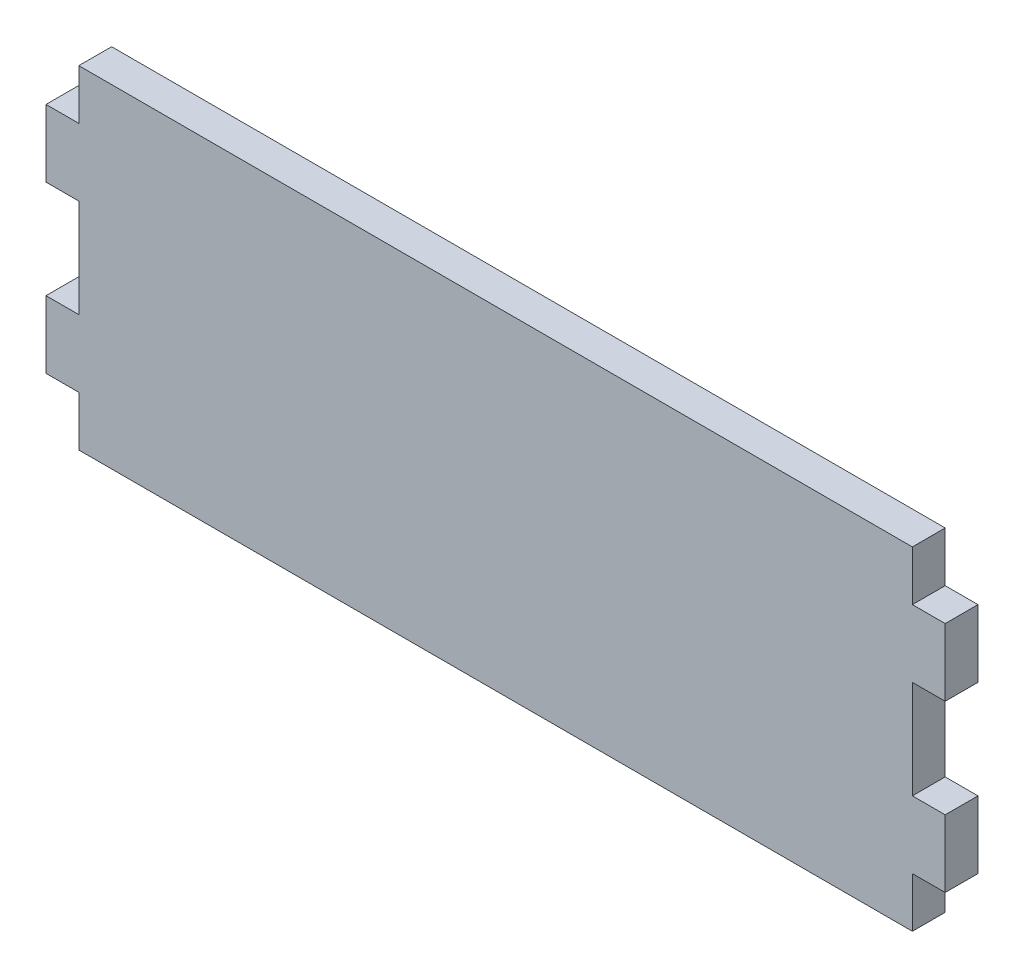
ISO-10303-21;
HEADER;
FILE_DESCRIPTION(('STEP AP214'),'2;1');
FILE_NAME('part.step','',(''),(''),'','','');
FILE_SCHEMA(('AUTOMOTIVE_DESIGN { 1 0 10303 214 1 1 1 1 }'));
ENDSEC;
DATA;
#1=APPLICATION_CONTEXT('core data for automotive mechanical design processes');
#2=APPLICATION_PROTOCOL_DEFINITION('international standard','automotive_design',2000,#1);
#3=PRODUCT_CONTEXT('',#1,'mechanical');
#4=PRODUCT('Part','Part','',(#3));
#5=PRODUCT_RELATED_PRODUCT_CATEGORY('part','',(#4));
#6=PRODUCT_DEFINITION_FORMATION('','',#4);
#7=PRODUCT_DEFINITION_CONTEXT('part definition',#1,'design');
#8=PRODUCT_DEFINITION('design','',#6,#7);
#9=PRODUCT_DEFINITION_SHAPE('','',#8);
#10=(LENGTH_UNIT() NAMED_UNIT(*) SI_UNIT(.MILLI.,.METRE.));
#11=(NAMED_UNIT(*) PLANE_ANGLE_UNIT() SI_UNIT($,.RADIAN.));
#12=(NAMED_UNIT(*) SI_UNIT($,.STERADIAN.) SOLID_ANGLE_UNIT());
#13=UNCERTAINTY_MEASURE_WITH_UNIT(LENGTH_MEASURE(1.E-05),#10,'distance_accuracy_value','');
#14=(GEOMETRIC_REPRESENTATION_CONTEXT(3) GLOBAL_UNCERTAINTY_ASSIGNED_CONTEXT((#13)) GLOBAL_UNIT_ASSIGNED_CONTEXT((#10,
#11,#12)) REPRESENTATION_CONTEXT('',''));
#15=CARTESIAN_POINT('',(0.,0.,0.));
#16=DIRECTION('',(0.,0.,1.));
#17=DIRECTION('',(1.,0.,0.));
#18=AXIS2_PLACEMENT_3D('',#15,#16,#17);
#19=CARTESIAN_POINT('',(-63.5,50.719999906,-5.));
#20=DIRECTION('',(-1.,0.,0.));
#21=DIRECTION('',(0.,0.,1.));
#22=AXIS2_PLACEMENT_3D('',#19,#20,#21);
#23=PLANE('',#22);
#24=DIRECTION('',(0.,0.,-1.));
#25=VECTOR('',#24,1.);
#26=CARTESIAN_POINT('',(-63.5,32.8494999941995,11.4087975961317));
#27=LINE('',#26,#25);
#28=CARTESIAN_POINT('',(-63.5,32.8494999941995,0.));
#29=VERTEX_POINT('',#28);
#30=CARTESIAN_POINT('',(-63.5,32.8494999941995,-5.));
#31=VERTEX_POINT('',#30);
#32=EDGE_CURVE('E51',#29,#31,#27,.T.);
#33=ORIENTED_EDGE('',*,*,#32,.T.);
#34=DIRECTION('',(0.,-1.,0.));
#35=VECTOR('',#34,1.);
#36=CARTESIAN_POINT('',(-63.5,50.719999906,-5.));
#37=LINE('',#36,#35);
#38=CARTESIAN_POINT('',(-63.5,17.8704999118005,-5.));
#39=VERTEX_POINT('',#38);
#40=EDGE_CURVE('E37',#31,#39,#37,.T.);
#41=ORIENTED_EDGE('',*,*,#40,.T.);
#42=DIRECTION('',(0.,0.,-1.));
#43=VECTOR('',#42,1.);
#44=CARTESIAN_POINT('',(-63.5,17.8704999118005,11.4087975961317));
#45=LINE('',#44,#43);
#46=CARTESIAN_POINT('',(-63.5,17.8704999118005,0.));
#47=VERTEX_POINT('',#46);
#48=EDGE_CURVE('E222',#47,#39,#45,.T.);
#49=ORIENTED_EDGE('',*,*,#48,.F.);
#50=DIRECTION('',(0.,-1.,0.));
#51=VECTOR('',#50,1.);
#52=CARTESIAN_POINT('',(-63.5,50.719999906,0.));
#53=LINE('',#52,#51);
#54=EDGE_CURVE('E238',#29,#47,#53,.T.);
#55=ORIENTED_EDGE('',*,*,#54,.F.);
#56=EDGE_LOOP('',(#33,#41,#49,#55));
#57=FACE_BOUND('',#56,.T.);
#58=ADVANCED_FACE('F33',(#57),#23,.T.);
#59=CARTESIAN_POINT('',(-63.5,7.61571261076396,0.));
#60=VERTEX_POINT('',#59);
#61=CARTESIAN_POINT('',(-63.5,0.,0.));
#62=VERTEX_POINT('',#61);
#63=EDGE_CURVE('E241',#60,#62,#53,.T.);
#64=ORIENTED_EDGE('',*,*,#63,.F.);
#65=DIRECTION('',(0.,0.,-1.));
#66=VECTOR('',#65,1.);
#67=CARTESIAN_POINT('',(-63.5,7.61571261076396,11.4087975961317));
#68=LINE('',#67,#66);
#69=CARTESIAN_POINT('',(-63.5,7.61571261076396,-5.));
#70=VERTEX_POINT('',#69);
#71=EDGE_CURVE('E226',#60,#70,#68,.T.);
#72=ORIENTED_EDGE('',*,*,#71,.T.);
#73=CARTESIAN_POINT('',(-63.5,0.,-5.));
#74=VERTEX_POINT('',#73);
#75=EDGE_CURVE('E282',#70,#74,#37,.T.);
#76=ORIENTED_EDGE('',*,*,#75,.T.);
#77=DIRECTION('',(0.,0.,1.));
#78=VECTOR('',#77,1.);
#79=CARTESIAN_POINT('',(-63.5,0.,-5.));
#80=LINE('',#79,#78);
#81=EDGE_CURVE('E287',#74,#62,#80,.T.);
#82=ORIENTED_EDGE('',*,*,#81,.T.);
#83=EDGE_LOOP('',(#64,#72,#76,#82));
#84=FACE_BOUND('',#83,.T.);
#85=ADVANCED_FACE('F398',(#84),#23,.T.);
#86=CARTESIAN_POINT('',(63.5,50.719999906,-5.));
#87=DIRECTION('',(1.,0.,0.));
#88=DIRECTION('',(0.,0.,-1.));
#89=AXIS2_PLACEMENT_3D('',#86,#87,#88);
#90=PLANE('',#89);
#91=DIRECTION('',(0.,0.,-1.));
#92=VECTOR('',#91,1.);
#93=CARTESIAN_POINT('',(63.5,17.8704999118005,11.4087975961317));
#94=LINE('',#93,#92);
#95=CARTESIAN_POINT('',(63.5,17.8704999118005,0.));
#96=VERTEX_POINT('',#95);
#97=CARTESIAN_POINT('',(63.5,17.8704999118005,-5.));
#98=VERTEX_POINT('',#97);
#99=EDGE_CURVE('E363',#96,#98,#94,.T.);
#100=ORIENTED_EDGE('',*,*,#99,.T.);
#101=DIRECTION('',(0.,1.,0.));
#102=VECTOR('',#101,1.);
#103=CARTESIAN_POINT('',(63.5,50.719999906,-5.));
#104=LINE('',#103,#102);
#105=CARTESIAN_POINT('',(63.5,32.8494999941995,-5.));
#106=VERTEX_POINT('',#105);
#107=EDGE_CURVE('E256',#98,#106,#104,.T.);
#108=ORIENTED_EDGE('',*,*,#107,.T.);
#109=DIRECTION('',(0.,0.,-1.));
#110=VECTOR('',#109,1.);
#111=CARTESIAN_POINT('',(63.5,32.8494999941995,11.4087975961317));
#112=LINE('',#111,#110);
#113=CARTESIAN_POINT('',(63.5,32.8494999941995,0.));
#114=VERTEX_POINT('',#113);
#115=EDGE_CURVE('E320',#114,#106,#112,.T.);
#116=ORIENTED_EDGE('',*,*,#115,.F.);
#117=DIRECTION('',(0.,1.,0.));
#118=VECTOR('',#117,1.);
#119=CARTESIAN_POINT('',(63.5,50.719999906,0.));
#120=LINE('',#119,#118);
#121=EDGE_CURVE('E260',#96,#114,#120,.T.);
#122=ORIENTED_EDGE('',*,*,#121,.F.);
#123=EDGE_LOOP('',(#100,#108,#116,#122));
#124=FACE_BOUND('',#123,.T.);
#125=ADVANCED_FACE('F415',(#124),#90,.T.);
#126=CARTESIAN_POINT('',(63.5,43.1042872952361,0.));
#127=VERTEX_POINT('',#126);
#128=CARTESIAN_POINT('',(63.5,50.719999906,0.));
#129=VERTEX_POINT('',#128);
#130=EDGE_CURVE('E272',#127,#129,#120,.T.);
#131=ORIENTED_EDGE('',*,*,#130,.F.);
#132=DIRECTION('',(0.,0.,-1.));
#133=VECTOR('',#132,1.);
#134=CARTESIAN_POINT('',(63.5,43.1042872952361,11.4087975961317));
#135=LINE('',#134,#133);
#136=CARTESIAN_POINT('',(63.5,43.1042872952361,-5.));
#137=VERTEX_POINT('',#136);
#138=EDGE_CURVE('E316',#127,#137,#135,.T.);
#139=ORIENTED_EDGE('',*,*,#138,.T.);
#140=CARTESIAN_POINT('',(63.5,50.719999906,-5.));
#141=VERTEX_POINT('',#140);
#142=EDGE_CURVE('E259',#137,#141,#104,.T.);
#143=ORIENTED_EDGE('',*,*,#142,.T.);
#144=DIRECTION('',(0.,0.,1.));
#145=VECTOR('',#144,1.);
#146=CARTESIAN_POINT('',(63.5,50.719999906,-5.));
#147=LINE('',#146,#145);
#148=EDGE_CURVE('E43',#141,#129,#147,.T.);
#149=ORIENTED_EDGE('',*,*,#148,.T.);
#150=EDGE_LOOP('',(#131,#139,#143,#149));
#151=FACE_BOUND('',#150,.T.);
#152=ADVANCED_FACE('F417',(#151),#90,.T.);
#153=DIRECTION('',(0.,0.,-1.));
#154=VECTOR('',#153,1.);
#155=CARTESIAN_POINT('',(-63.5,43.1042872952361,11.4087975961317));
#156=LINE('',#155,#154);
#157=CARTESIAN_POINT('',(-63.5,43.1042872952361,0.));
#158=VERTEX_POINT('',#157);
#159=CARTESIAN_POINT('',(-63.5,43.1042872952361,-5.));
#160=VERTEX_POINT('',#159);
#161=EDGE_CURVE('E189',#158,#160,#156,.T.);
#162=ORIENTED_EDGE('',*,*,#161,.F.);
#163=CARTESIAN_POINT('',(-63.5,50.719999906,0.));
#164=VERTEX_POINT('',#163);
#165=EDGE_CURVE('E240',#164,#158,#53,.T.);
#166=ORIENTED_EDGE('',*,*,#165,.F.);
#167=DIRECTION('',(0.,0.,1.));
#168=VECTOR('',#167,1.);
#169=CARTESIAN_POINT('',(-63.5,50.719999906,-5.));
#170=LINE('',#169,#168);
#171=CARTESIAN_POINT('',(-63.5,50.719999906,-5.));
#172=VERTEX_POINT('',#171);
#173=EDGE_CURVE('E11',#172,#164,#170,.T.);
#174=ORIENTED_EDGE('',*,*,#173,.F.);
#175=EDGE_CURVE('E302',#172,#160,#37,.T.);
#176=ORIENTED_EDGE('',*,*,#175,.T.);
#177=EDGE_LOOP('',(#162,#166,#174,#176));
#178=FACE_BOUND('',#177,.T.);
#179=ADVANCED_FACE('F35',(#178),#23,.T.);
#180=CARTESIAN_POINT('',(-63.5,50.719999906,-5.));
#181=DIRECTION('',(0.,1.,0.));
#182=DIRECTION('',(0.,0.,1.));
#183=AXIS2_PLACEMENT_3D('',#180,#181,#182);
#184=PLANE('',#183);
#185=DIRECTION('',(-1.,0.,0.));
#186=VECTOR('',#185,1.);
#187=CARTESIAN_POINT('',(-63.5,50.719999906,0.));
#188=LINE('',#187,#186);
#189=EDGE_CURVE('E278',#129,#164,#188,.T.);
#190=ORIENTED_EDGE('',*,*,#189,.F.);
#191=ORIENTED_EDGE('',*,*,#148,.F.);
#192=DIRECTION('',(-1.,0.,0.));
#193=VECTOR('',#192,1.);
#194=CARTESIAN_POINT('',(-63.5,50.719999906,-5.));
#195=LINE('',#194,#193);
#196=EDGE_CURVE('E245',#141,#172,#195,.T.);
#197=ORIENTED_EDGE('',*,*,#196,.T.);
#198=ORIENTED_EDGE('',*,*,#173,.T.);
#199=EDGE_LOOP('',(#190,#191,#197,#198));
#200=FACE_BOUND('',#199,.T.);
#201=ADVANCED_FACE('F298',(#200),#184,.T.);
#202=DIRECTION('',(0.,0.,-1.));
#203=VECTOR('',#202,1.);
#204=CARTESIAN_POINT('',(63.5,7.61571261076392,11.4087975961317));
#205=LINE('',#204,#203);
#206=CARTESIAN_POINT('',(63.5,7.61571261076392,0.));
#207=VERTEX_POINT('',#206);
#208=CARTESIAN_POINT('',(63.5,7.61571261076392,-5.));
#209=VERTEX_POINT('',#208);
#210=EDGE_CURVE('E353',#207,#209,#205,.T.);
#211=ORIENTED_EDGE('',*,*,#210,.F.);
#212=CARTESIAN_POINT('',(63.5,0.,0.));
#213=VERTEX_POINT('',#212);
#214=EDGE_CURVE('E274',#213,#207,#120,.T.);
#215=ORIENTED_EDGE('',*,*,#214,.F.);
#216=DIRECTION('',(0.,0.,1.));
#217=VECTOR('',#216,1.);
#218=CARTESIAN_POINT('',(63.5,0.,-5.));
#219=LINE('',#218,#217);
#220=CARTESIAN_POINT('',(63.5,0.,-5.));
#221=VERTEX_POINT('',#220);
#222=EDGE_CURVE('E286',#221,#213,#219,.T.);
#223=ORIENTED_EDGE('',*,*,#222,.F.);
#224=EDGE_CURVE('E258',#221,#209,#104,.T.);
#225=ORIENTED_EDGE('',*,*,#224,.T.);
#226=EDGE_LOOP('',(#211,#215,#223,#225));
#227=FACE_BOUND('',#226,.T.);
#228=ADVANCED_FACE('F422',(#227),#90,.T.);
#229=CARTESIAN_POINT('',(-63.5,0.,-5.));
#230=DIRECTION('',(0.,-1.,0.));
#231=DIRECTION('',(0.,0.,-1.));
#232=AXIS2_PLACEMENT_3D('',#229,#230,#231);
#233=PLANE('',#232);
#234=DIRECTION('',(1.,0.,0.));
#235=VECTOR('',#234,1.);
#236=CARTESIAN_POINT('',(-63.5,0.,0.));
#237=LINE('',#236,#235);
#238=EDGE_CURVE('E247',#62,#213,#237,.T.);
#239=ORIENTED_EDGE('',*,*,#238,.F.);
#240=ORIENTED_EDGE('',*,*,#81,.F.);
#241=DIRECTION('',(1.,0.,0.));
#242=VECTOR('',#241,1.);
#243=CARTESIAN_POINT('',(-63.5,0.,-5.));
#244=LINE('',#243,#242);
#245=EDGE_CURVE('E264',#74,#221,#244,.T.);
#246=ORIENTED_EDGE('',*,*,#245,.T.);
#247=ORIENTED_EDGE('',*,*,#222,.T.);
#248=EDGE_LOOP('',(#239,#240,#246,#247));
#249=FACE_BOUND('',#248,.T.);
#250=ADVANCED_FACE('F400',(#249),#233,.T.);
#251=CARTESIAN_POINT('',(0.,0.,-5.));
#252=DIRECTION('',(0.,0.,1.));
#253=DIRECTION('',(1.,0.,0.));
#254=AXIS2_PLACEMENT_3D('',#251,#252,#253);
#255=PLANE('',#254);
#256=ORIENTED_EDGE('',*,*,#175,.F.);
#257=ORIENTED_EDGE('',*,*,#196,.F.);
#258=ORIENTED_EDGE('',*,*,#142,.F.);
#259=DIRECTION('',(1.,0.,0.));
#260=VECTOR('',#259,1.);
#261=CARTESIAN_POINT('',(63.5,43.1042872952361,-5.));
#262=LINE('',#261,#260);
#263=CARTESIAN_POINT('',(68.5,43.1042872952361,-5.));
#264=VERTEX_POINT('',#263);
#265=EDGE_CURVE('E348',#137,#264,#262,.T.);
#266=ORIENTED_EDGE('',*,*,#265,.T.);
#267=DIRECTION('',(0.,-1.,0.));
#268=VECTOR('',#267,1.);
#269=CARTESIAN_POINT('',(68.5,43.1042872952361,-5.));
#270=LINE('',#269,#268);
#271=CARTESIAN_POINT('',(68.5,32.8494999941995,-5.));
#272=VERTEX_POINT('',#271);
#273=EDGE_CURVE('E349',#264,#272,#270,.T.);
#274=ORIENTED_EDGE('',*,*,#273,.T.);
#275=DIRECTION('',(-1.,0.,0.));
#276=VECTOR('',#275,1.);
#277=CARTESIAN_POINT('',(63.5,32.8494999941995,-5.));
#278=LINE('',#277,#276);
#279=EDGE_CURVE('E325',#272,#106,#278,.T.);
#280=ORIENTED_EDGE('',*,*,#279,.T.);
#281=ORIENTED_EDGE('',*,*,#107,.F.);
#282=DIRECTION('',(1.,0.,0.));
#283=VECTOR('',#282,1.);
#284=CARTESIAN_POINT('',(63.5,17.8704999118005,-5.));
#285=LINE('',#284,#283);
#286=CARTESIAN_POINT('',(68.5,17.8704999118005,-5.));
#287=VERTEX_POINT('',#286);
#288=EDGE_CURVE('E378',#98,#287,#285,.T.);
#289=ORIENTED_EDGE('',*,*,#288,.T.);
#290=DIRECTION('',(0.,-1.,0.));
#291=VECTOR('',#290,1.);
#292=CARTESIAN_POINT('',(68.5,7.61571261076392,-5.));
#293=LINE('',#292,#291);
#294=CARTESIAN_POINT('',(68.5,7.61571261076392,-5.));
#295=VERTEX_POINT('',#294);
#296=EDGE_CURVE('E367',#287,#295,#293,.T.);
#297=ORIENTED_EDGE('',*,*,#296,.T.);
#298=DIRECTION('',(-1.,0.,0.));
#299=VECTOR('',#298,1.);
#300=CARTESIAN_POINT('',(63.5,7.61571261076392,-5.));
#301=LINE('',#300,#299);
#302=EDGE_CURVE('E376',#295,#209,#301,.T.);
#303=ORIENTED_EDGE('',*,*,#302,.T.);
#304=ORIENTED_EDGE('',*,*,#224,.F.);
#305=ORIENTED_EDGE('',*,*,#245,.F.);
#306=ORIENTED_EDGE('',*,*,#75,.F.);
#307=DIRECTION('',(-1.,0.,0.));
#308=VECTOR('',#307,1.);
#309=CARTESIAN_POINT('',(-63.5,7.61571261076396,-5.));
#310=LINE('',#309,#308);
#311=CARTESIAN_POINT('',(-68.5,7.61571261076396,-5.));
#312=VERTEX_POINT('',#311);
#313=EDGE_CURVE('E59',#70,#312,#310,.T.);
#314=ORIENTED_EDGE('',*,*,#313,.T.);
#315=DIRECTION('',(0.,1.,0.));
#316=VECTOR('',#315,1.);
#317=CARTESIAN_POINT('',(-68.5,7.61571261076396,-5.));
#318=LINE('',#317,#316);
#319=CARTESIAN_POINT('',(-68.5,17.8704999118005,-5.));
#320=VERTEX_POINT('',#319);
#321=EDGE_CURVE('E209',#312,#320,#318,.T.);
#322=ORIENTED_EDGE('',*,*,#321,.T.);
#323=DIRECTION('',(1.,0.,0.));
#324=VECTOR('',#323,1.);
#325=CARTESIAN_POINT('',(-63.5,17.8704999118005,-5.));
#326=LINE('',#325,#324);
#327=EDGE_CURVE('E212',#320,#39,#326,.T.);
#328=ORIENTED_EDGE('',*,*,#327,.T.);
#329=ORIENTED_EDGE('',*,*,#40,.F.);
#330=DIRECTION('',(-1.,0.,0.));
#331=VECTOR('',#330,1.);
#332=CARTESIAN_POINT('',(-63.5,32.8494999941995,-5.));
#333=LINE('',#332,#331);
#334=CARTESIAN_POINT('',(-68.5,32.8494999941995,-5.));
#335=VERTEX_POINT('',#334);
#336=EDGE_CURVE('E193',#31,#335,#333,.T.);
#337=ORIENTED_EDGE('',*,*,#336,.T.);
#338=DIRECTION('',(0.,1.,0.));
#339=VECTOR('',#338,1.);
#340=CARTESIAN_POINT('',(-68.5,43.1042872952361,-5.));
#341=LINE('',#340,#339);
#342=CARTESIAN_POINT('',(-68.5,43.1042872952361,-5.));
#343=VERTEX_POINT('',#342);
#344=EDGE_CURVE('E180',#335,#343,#341,.T.);
#345=ORIENTED_EDGE('',*,*,#344,.T.);
#346=DIRECTION('',(1.,0.,0.));
#347=VECTOR('',#346,1.);
#348=CARTESIAN_POINT('',(-63.5,43.1042872952361,-5.));
#349=LINE('',#348,#347);
#350=EDGE_CURVE('E186',#343,#160,#349,.T.);
#351=ORIENTED_EDGE('',*,*,#350,.T.);
#352=EDGE_LOOP('',(#256,#257,#258,#266,#274,#280,#281,#289,#297,#303,#304,#305,#306,#314,#322,
#328,#329,#337,#345,#351));
#353=FACE_BOUND('',#352,.T.);
#354=ADVANCED_FACE('F196',(#353),#255,.F.);
#355=CARTESIAN_POINT('',(0.,0.,0.));
#356=DIRECTION('',(0.,0.,1.));
#357=DIRECTION('',(1.,0.,0.));
#358=AXIS2_PLACEMENT_3D('',#355,#356,#357);
#359=PLANE('',#358);
#360=ORIENTED_EDGE('',*,*,#165,.T.);
#361=DIRECTION('',(1.,0.,0.));
#362=VECTOR('',#361,1.);
#363=CARTESIAN_POINT('',(-63.5,43.1042872952361,0.));
#364=LINE('',#363,#362);
#365=CARTESIAN_POINT('',(-68.5,43.1042872952361,0.));
#366=VERTEX_POINT('',#365);
#367=EDGE_CURVE('E183',#366,#158,#364,.T.);
#368=ORIENTED_EDGE('',*,*,#367,.F.);
#369=DIRECTION('',(0.,1.,0.));
#370=VECTOR('',#369,1.);
#371=CARTESIAN_POINT('',(-68.5,43.1042872952361,0.));
#372=LINE('',#371,#370);
#373=CARTESIAN_POINT('',(-68.5,32.8494999941995,0.));
#374=VERTEX_POINT('',#373);
#375=EDGE_CURVE('E181',#374,#366,#372,.T.);
#376=ORIENTED_EDGE('',*,*,#375,.F.);
#377=DIRECTION('',(-1.,0.,0.));
#378=VECTOR('',#377,1.);
#379=CARTESIAN_POINT('',(-63.5,32.8494999941995,0.));
#380=LINE('',#379,#378);
#381=EDGE_CURVE('E199',#29,#374,#380,.T.);
#382=ORIENTED_EDGE('',*,*,#381,.F.);
#383=ORIENTED_EDGE('',*,*,#54,.T.);
#384=DIRECTION('',(1.,0.,0.));
#385=VECTOR('',#384,1.);
#386=CARTESIAN_POINT('',(-63.5,17.8704999118005,0.));
#387=LINE('',#386,#385);
#388=CARTESIAN_POINT('',(-68.5,17.8704999118005,0.));
#389=VERTEX_POINT('',#388);
#390=EDGE_CURVE('E227',#389,#47,#387,.T.);
#391=ORIENTED_EDGE('',*,*,#390,.F.);
#392=DIRECTION('',(0.,1.,0.));
#393=VECTOR('',#392,1.);
#394=CARTESIAN_POINT('',(-68.5,7.61571261076396,0.));
#395=LINE('',#394,#393);
#396=CARTESIAN_POINT('',(-68.5,7.61571261076396,0.));
#397=VERTEX_POINT('',#396);
#398=EDGE_CURVE('E213',#397,#389,#395,.T.);
#399=ORIENTED_EDGE('',*,*,#398,.F.);
#400=DIRECTION('',(-1.,0.,0.));
#401=VECTOR('',#400,1.);
#402=CARTESIAN_POINT('',(-63.5,7.61571261076396,0.));
#403=LINE('',#402,#401);
#404=EDGE_CURVE('E236',#60,#397,#403,.T.);
#405=ORIENTED_EDGE('',*,*,#404,.F.);
#406=ORIENTED_EDGE('',*,*,#63,.T.);
#407=ORIENTED_EDGE('',*,*,#238,.T.);
#408=ORIENTED_EDGE('',*,*,#214,.T.);
#409=DIRECTION('',(-1.,0.,0.));
#410=VECTOR('',#409,1.);
#411=CARTESIAN_POINT('',(63.5,7.61571261076392,0.));
#412=LINE('',#411,#410);
#413=CARTESIAN_POINT('',(68.5,7.61571261076392,0.));
#414=VERTEX_POINT('',#413);
#415=EDGE_CURVE('E354',#414,#207,#412,.T.);
#416=ORIENTED_EDGE('',*,*,#415,.F.);
#417=DIRECTION('',(0.,-1.,0.));
#418=VECTOR('',#417,1.);
#419=CARTESIAN_POINT('',(68.5,7.61571261076392,0.));
#420=LINE('',#419,#418);
#421=CARTESIAN_POINT('',(68.5,17.8704999118005,0.));
#422=VERTEX_POINT('',#421);
#423=EDGE_CURVE('E370',#422,#414,#420,.T.);
#424=ORIENTED_EDGE('',*,*,#423,.F.);
#425=DIRECTION('',(1.,0.,0.));
#426=VECTOR('',#425,1.);
#427=CARTESIAN_POINT('',(63.5,17.8704999118005,0.));
#428=LINE('',#427,#426);
#429=EDGE_CURVE('E366',#96,#422,#428,.T.);
#430=ORIENTED_EDGE('',*,*,#429,.F.);
#431=ORIENTED_EDGE('',*,*,#121,.T.);
#432=DIRECTION('',(-1.,0.,0.));
#433=VECTOR('',#432,1.);
#434=CARTESIAN_POINT('',(63.5,32.8494999941995,0.));
#435=LINE('',#434,#433);
#436=CARTESIAN_POINT('',(68.5,32.8494999941995,0.));
#437=VERTEX_POINT('',#436);
#438=EDGE_CURVE('E331',#437,#114,#435,.T.);
#439=ORIENTED_EDGE('',*,*,#438,.F.);
#440=DIRECTION('',(0.,-1.,0.));
#441=VECTOR('',#440,1.);
#442=CARTESIAN_POINT('',(68.5,43.1042872952361,0.));
#443=LINE('',#442,#441);
#444=CARTESIAN_POINT('',(68.5,43.1042872952361,0.));
#445=VERTEX_POINT('',#444);
#446=EDGE_CURVE('E335',#445,#437,#443,.T.);
#447=ORIENTED_EDGE('',*,*,#446,.F.);
#448=DIRECTION('',(1.,0.,0.));
#449=VECTOR('',#448,1.);
#450=CARTESIAN_POINT('',(63.5,43.1042872952361,0.));
#451=LINE('',#450,#449);
#452=EDGE_CURVE('E322',#127,#445,#451,.T.);
#453=ORIENTED_EDGE('',*,*,#452,.F.);
#454=ORIENTED_EDGE('',*,*,#130,.T.);
#455=ORIENTED_EDGE('',*,*,#189,.T.);
#456=EDGE_LOOP('',(#360,#368,#376,#382,#383,#391,#399,#405,#406,#407,#408,#416,#424,#430,#431,
#439,#447,#453,#454,#455));
#457=FACE_BOUND('',#456,.T.);
#458=ADVANCED_FACE('F405',(#457),#359,.T.);
#459=CARTESIAN_POINT('',(63.5,43.1042872952361,11.4087975961317));
#460=DIRECTION('',(0.,1.,0.));
#461=DIRECTION('',(0.,0.,1.));
#462=AXIS2_PLACEMENT_3D('',#459,#460,#461);
#463=PLANE('',#462);
#464=ORIENTED_EDGE('',*,*,#138,.F.);
#465=ORIENTED_EDGE('',*,*,#452,.T.);
#466=DIRECTION('',(0.,0.,-1.));
#467=VECTOR('',#466,1.);
#468=CARTESIAN_POINT('',(68.5,43.1042872952361,11.4087975961317));
#469=LINE('',#468,#467);
#470=EDGE_CURVE('E313',#445,#264,#469,.T.);
#471=ORIENTED_EDGE('',*,*,#470,.T.);
#472=ORIENTED_EDGE('',*,*,#265,.F.);
#473=EDGE_LOOP('',(#464,#465,#471,#472));
#474=FACE_BOUND('',#473,.T.);
#475=ADVANCED_FACE('F347',(#474),#463,.T.);
#476=CARTESIAN_POINT('',(68.5,43.1042872952361,11.4087975961317));
#477=DIRECTION('',(1.,0.,0.));
#478=DIRECTION('',(0.,0.,-1.));
#479=AXIS2_PLACEMENT_3D('',#476,#477,#478);
#480=PLANE('',#479);
#481=ORIENTED_EDGE('',*,*,#470,.F.);
#482=ORIENTED_EDGE('',*,*,#446,.T.);
#483=DIRECTION('',(0.,0.,-1.));
#484=VECTOR('',#483,1.);
#485=CARTESIAN_POINT('',(68.5,32.8494999941995,11.4087975961317));
#486=LINE('',#485,#484);
#487=EDGE_CURVE('E337',#437,#272,#486,.T.);
#488=ORIENTED_EDGE('',*,*,#487,.T.);
#489=ORIENTED_EDGE('',*,*,#273,.F.);
#490=EDGE_LOOP('',(#481,#482,#488,#489));
#491=FACE_BOUND('',#490,.T.);
#492=ADVANCED_FACE('F350',(#491),#480,.T.);
#493=CARTESIAN_POINT('',(63.5,32.8494999941995,11.4087975961317));
#494=DIRECTION('',(0.,-1.,0.));
#495=DIRECTION('',(0.,0.,-1.));
#496=AXIS2_PLACEMENT_3D('',#493,#494,#495);
#497=PLANE('',#496);
#498=ORIENTED_EDGE('',*,*,#487,.F.);
#499=ORIENTED_EDGE('',*,*,#438,.T.);
#500=ORIENTED_EDGE('',*,*,#115,.T.);
#501=ORIENTED_EDGE('',*,*,#279,.F.);
#502=EDGE_LOOP('',(#498,#499,#500,#501));
#503=FACE_BOUND('',#502,.T.);
#504=ADVANCED_FACE('F431',(#503),#497,.T.);
#505=CARTESIAN_POINT('',(63.5,17.8704999118005,11.4087975961317));
#506=DIRECTION('',(0.,1.,0.));
#507=DIRECTION('',(0.,0.,1.));
#508=AXIS2_PLACEMENT_3D('',#505,#506,#507);
#509=PLANE('',#508);
#510=ORIENTED_EDGE('',*,*,#99,.F.);
#511=ORIENTED_EDGE('',*,*,#429,.T.);
#512=DIRECTION('',(0.,0.,-1.));
#513=VECTOR('',#512,1.);
#514=CARTESIAN_POINT('',(68.5,17.8704999118005,11.4087975961317));
#515=LINE('',#514,#513);
#516=EDGE_CURVE('E368',#422,#287,#515,.T.);
#517=ORIENTED_EDGE('',*,*,#516,.T.);
#518=ORIENTED_EDGE('',*,*,#288,.F.);
#519=EDGE_LOOP('',(#510,#511,#517,#518));
#520=FACE_BOUND('',#519,.T.);
#521=ADVANCED_FACE('F439',(#520),#509,.T.);
#522=CARTESIAN_POINT('',(68.5,7.61571261076392,11.4087975961317));
#523=DIRECTION('',(1.,0.,0.));
#524=DIRECTION('',(0.,0.,-1.));
#525=AXIS2_PLACEMENT_3D('',#522,#523,#524);
#526=PLANE('',#525);
#527=ORIENTED_EDGE('',*,*,#516,.F.);
#528=ORIENTED_EDGE('',*,*,#423,.T.);
#529=DIRECTION('',(0.,0.,-1.));
#530=VECTOR('',#529,1.);
#531=CARTESIAN_POINT('',(68.5,7.61571261076392,11.4087975961317));
#532=LINE('',#531,#530);
#533=EDGE_CURVE('E360',#414,#295,#532,.T.);
#534=ORIENTED_EDGE('',*,*,#533,.T.);
#535=ORIENTED_EDGE('',*,*,#296,.F.);
#536=EDGE_LOOP('',(#527,#528,#534,#535));
#537=FACE_BOUND('',#536,.T.);
#538=ADVANCED_FACE('F443',(#537),#526,.T.);
#539=CARTESIAN_POINT('',(63.5,7.61571261076392,11.4087975961317));
#540=DIRECTION('',(0.,-1.,0.));
#541=DIRECTION('',(0.,0.,-1.));
#542=AXIS2_PLACEMENT_3D('',#539,#540,#541);
#543=PLANE('',#542);
#544=ORIENTED_EDGE('',*,*,#533,.F.);
#545=ORIENTED_EDGE('',*,*,#415,.T.);
#546=ORIENTED_EDGE('',*,*,#210,.T.);
#547=ORIENTED_EDGE('',*,*,#302,.F.);
#548=EDGE_LOOP('',(#544,#545,#546,#547));
#549=FACE_BOUND('',#548,.T.);
#550=ADVANCED_FACE('F529',(#549),#543,.T.);
#551=CARTESIAN_POINT('',(-63.5,7.61571261076396,11.4087975961317));
#552=DIRECTION('',(0.,-1.,0.));
#553=DIRECTION('',(1.,0.,0.));
#554=AXIS2_PLACEMENT_3D('',#551,#552,#553);
#555=PLANE('',#554);
#556=ORIENTED_EDGE('',*,*,#71,.F.);
#557=ORIENTED_EDGE('',*,*,#404,.T.);
#558=DIRECTION('',(0.,0.,-1.));
#559=VECTOR('',#558,1.);
#560=CARTESIAN_POINT('',(-68.5,7.61571261076396,11.4087975961317));
#561=LINE('',#560,#559);
#562=EDGE_CURVE('E217',#397,#312,#561,.T.);
#563=ORIENTED_EDGE('',*,*,#562,.T.);
#564=ORIENTED_EDGE('',*,*,#313,.F.);
#565=EDGE_LOOP('',(#556,#557,#563,#564));
#566=FACE_BOUND('',#565,.T.);
#567=ADVANCED_FACE('F390',(#566),#555,.T.);
#568=CARTESIAN_POINT('',(-68.5,7.61571261076396,11.4087975961317));
#569=DIRECTION('',(-1.,0.,0.));
#570=DIRECTION('',(0.,0.,1.));
#571=AXIS2_PLACEMENT_3D('',#568,#569,#570);
#572=PLANE('',#571);
#573=ORIENTED_EDGE('',*,*,#562,.F.);
#574=ORIENTED_EDGE('',*,*,#398,.T.);
#575=DIRECTION('',(0.,0.,-1.));
#576=VECTOR('',#575,1.);
#577=CARTESIAN_POINT('',(-68.5,17.8704999118005,11.4087975961317));
#578=LINE('',#577,#576);
#579=EDGE_CURVE('E216',#389,#320,#578,.T.);
#580=ORIENTED_EDGE('',*,*,#579,.T.);
#581=ORIENTED_EDGE('',*,*,#321,.F.);
#582=EDGE_LOOP('',(#573,#574,#580,#581));
#583=FACE_BOUND('',#582,.T.);
#584=ADVANCED_FACE('F392',(#583),#572,.T.);
#585=CARTESIAN_POINT('',(-63.5,17.8704999118005,11.4087975961317));
#586=DIRECTION('',(0.,1.,0.));
#587=DIRECTION('',(0.,0.,1.));
#588=AXIS2_PLACEMENT_3D('',#585,#586,#587);
#589=PLANE('',#588);
#590=ORIENTED_EDGE('',*,*,#579,.F.);
#591=ORIENTED_EDGE('',*,*,#390,.T.);
#592=ORIENTED_EDGE('',*,*,#48,.T.);
#593=ORIENTED_EDGE('',*,*,#327,.F.);
#594=EDGE_LOOP('',(#590,#591,#592,#593));
#595=FACE_BOUND('',#594,.T.);
#596=ADVANCED_FACE('F409',(#595),#589,.T.);
#597=CARTESIAN_POINT('',(-63.5,32.8494999941995,11.4087975961317));
#598=DIRECTION('',(0.,-1.,0.));
#599=DIRECTION('',(0.,0.,-1.));
#600=AXIS2_PLACEMENT_3D('',#597,#598,#599);
#601=PLANE('',#600);
#602=ORIENTED_EDGE('',*,*,#32,.F.);
#603=ORIENTED_EDGE('',*,*,#381,.T.);
#604=DIRECTION('',(0.,0.,-1.));
#605=VECTOR('',#604,1.);
#606=CARTESIAN_POINT('',(-68.5,32.8494999941995,11.4087975961317));
#607=LINE('',#606,#605);
#608=EDGE_CURVE('E205',#374,#335,#607,.T.);
#609=ORIENTED_EDGE('',*,*,#608,.T.);
#610=ORIENTED_EDGE('',*,*,#336,.F.);
#611=EDGE_LOOP('',(#602,#603,#609,#610));
#612=FACE_BOUND('',#611,.T.);
#613=ADVANCED_FACE('F562',(#612),#601,.T.);
#614=CARTESIAN_POINT('',(-68.5,43.1042872952361,11.4087975961317));
#615=DIRECTION('',(-1.,0.,0.));
#616=DIRECTION('',(0.,0.,1.));
#617=AXIS2_PLACEMENT_3D('',#614,#615,#616);
#618=PLANE('',#617);
#619=ORIENTED_EDGE('',*,*,#608,.F.);
#620=ORIENTED_EDGE('',*,*,#375,.T.);
#621=DIRECTION('',(0.,0.,-1.));
#622=VECTOR('',#621,1.);
#623=CARTESIAN_POINT('',(-68.5,43.1042872952361,11.4087975961317));
#624=LINE('',#623,#622);
#625=EDGE_CURVE('E175',#366,#343,#624,.T.);
#626=ORIENTED_EDGE('',*,*,#625,.T.);
#627=ORIENTED_EDGE('',*,*,#344,.F.);
#628=EDGE_LOOP('',(#619,#620,#626,#627));
#629=FACE_BOUND('',#628,.T.);
#630=ADVANCED_FACE('F178',(#629),#618,.T.);
#631=CARTESIAN_POINT('',(-63.5,43.1042872952361,11.4087975961317));
#632=DIRECTION('',(0.,1.,0.));
#633=DIRECTION('',(0.,0.,1.));
#634=AXIS2_PLACEMENT_3D('',#631,#632,#633);
#635=PLANE('',#634);
#636=ORIENTED_EDGE('',*,*,#625,.F.);
#637=ORIENTED_EDGE('',*,*,#367,.T.);
#638=ORIENTED_EDGE('',*,*,#161,.T.);
#639=ORIENTED_EDGE('',*,*,#350,.F.);
#640=EDGE_LOOP('',(#636,#637,#638,#639));
#641=FACE_BOUND('',#640,.T.);
#642=ADVANCED_FACE('F187',(#641),#635,.T.);
#643=CLOSED_SHELL('',(#58,#85,#125,#152,#179,#201,#228,#250,#354,#458,#475,#492,#504,#521,#538,
#550,#567,#584,#596,#613,#630,#642));
#644=MANIFOLD_SOLID_BREP('B2',#643);
#645=ADVANCED_BREP_SHAPE_REPRESENTATION('',(#18,#644),#14);
#646=SHAPE_DEFINITION_REPRESENTATION(#9,#645);
ENDSEC;
END-ISO-10303-21;
